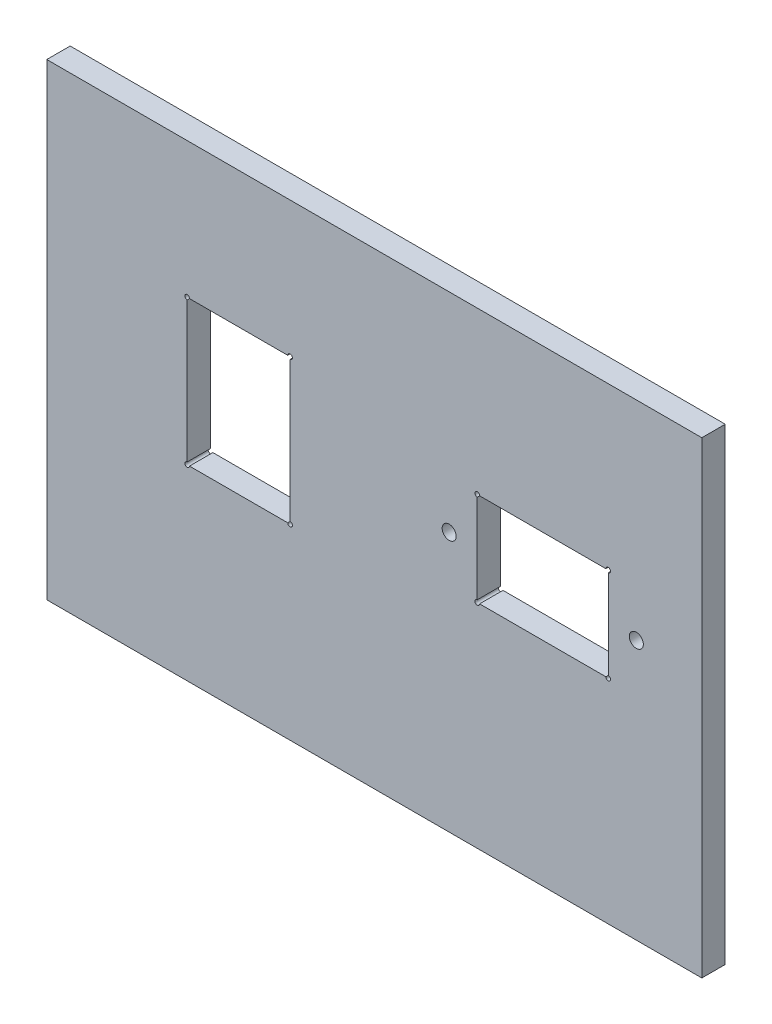
ISO-10303-21;
HEADER;
FILE_DESCRIPTION(('STEP AP214'),'2;1');
FILE_NAME('part.step','',(''),(''),'','','');
FILE_SCHEMA(('AUTOMOTIVE_DESIGN { 1 0 10303 214 1 1 1 1 }'));
ENDSEC;
DATA;
#1=APPLICATION_CONTEXT('core data for automotive mechanical design processes');
#2=APPLICATION_PROTOCOL_DEFINITION('international standard','automotive_design',2000,#1);
#3=PRODUCT_CONTEXT('',#1,'mechanical');
#4=PRODUCT('Part','Part','',(#3));
#5=PRODUCT_RELATED_PRODUCT_CATEGORY('part','',(#4));
#6=PRODUCT_DEFINITION_FORMATION('','',#4);
#7=PRODUCT_DEFINITION_CONTEXT('part definition',#1,'design');
#8=PRODUCT_DEFINITION('design','',#6,#7);
#9=PRODUCT_DEFINITION_SHAPE('','',#8);
#10=(LENGTH_UNIT() NAMED_UNIT(*) SI_UNIT(.MILLI.,.METRE.));
#11=(NAMED_UNIT(*) PLANE_ANGLE_UNIT() SI_UNIT($,.RADIAN.));
#12=(NAMED_UNIT(*) SI_UNIT($,.STERADIAN.) SOLID_ANGLE_UNIT());
#13=UNCERTAINTY_MEASURE_WITH_UNIT(LENGTH_MEASURE(1.E-05),#10,'distance_accuracy_value','');
#14=(GEOMETRIC_REPRESENTATION_CONTEXT(3) GLOBAL_UNCERTAINTY_ASSIGNED_CONTEXT((#13)) GLOBAL_UNIT_ASSIGNED_CONTEXT((#10,
#11,#12)) REPRESENTATION_CONTEXT('',''));
#15=CARTESIAN_POINT('',(0.,0.,0.));
#16=DIRECTION('',(0.,0.,1.));
#17=DIRECTION('',(1.,0.,0.));
#18=AXIS2_PLACEMENT_3D('',#15,#16,#17);
#19=CARTESIAN_POINT('',(70.,50.,5.));
#20=DIRECTION('',(-1.,0.,0.));
#21=DIRECTION('',(0.,0.,1.));
#22=AXIS2_PLACEMENT_3D('',#19,#20,#21);
#23=PLANE('',#22);
#24=DIRECTION('',(0.,1.,0.));
#25=VECTOR('',#24,1.);
#26=CARTESIAN_POINT('',(70.,50.,0.));
#27=LINE('',#26,#25);
#28=CARTESIAN_POINT('',(70.,-50.,0.));
#29=VERTEX_POINT('',#28);
#30=CARTESIAN_POINT('',(70.,50.,0.));
#31=VERTEX_POINT('',#30);
#32=EDGE_CURVE('E226',#29,#31,#27,.T.);
#33=ORIENTED_EDGE('',*,*,#32,.T.);
#34=DIRECTION('',(0.,0.,-1.));
#35=VECTOR('',#34,1.);
#36=CARTESIAN_POINT('',(70.,50.,5.));
#37=LINE('',#36,#35);
#38=CARTESIAN_POINT('',(70.,50.,5.));
#39=VERTEX_POINT('',#38);
#40=EDGE_CURVE('E263',#39,#31,#37,.T.);
#41=ORIENTED_EDGE('',*,*,#40,.F.);
#42=DIRECTION('',(0.,1.,0.));
#43=VECTOR('',#42,1.);
#44=CARTESIAN_POINT('',(70.,50.,5.));
#45=LINE('',#44,#43);
#46=CARTESIAN_POINT('',(70.,-50.,5.));
#47=VERTEX_POINT('',#46);
#48=EDGE_CURVE('E237',#47,#39,#45,.T.);
#49=ORIENTED_EDGE('',*,*,#48,.F.);
#50=DIRECTION('',(0.,0.,-1.));
#51=VECTOR('',#50,1.);
#52=CARTESIAN_POINT('',(70.,-50.,5.));
#53=LINE('',#52,#51);
#54=EDGE_CURVE('E247',#47,#29,#53,.T.);
#55=ORIENTED_EDGE('',*,*,#54,.T.);
#56=EDGE_LOOP('',(#33,#41,#49,#55));
#57=FACE_BOUND('',#56,.T.);
#58=ADVANCED_FACE('F34',(#57),#23,.F.);
#59=CARTESIAN_POINT('',(-70.,50.,5.));
#60=DIRECTION('',(0.,-1.,0.));
#61=DIRECTION('',(0.,0.,-1.));
#62=AXIS2_PLACEMENT_3D('',#59,#60,#61);
#63=PLANE('',#62);
#64=DIRECTION('',(-1.,0.,0.));
#65=VECTOR('',#64,1.);
#66=CARTESIAN_POINT('',(-70.,50.,0.));
#67=LINE('',#66,#65);
#68=CARTESIAN_POINT('',(-70.,50.,0.));
#69=VERTEX_POINT('',#68);
#70=EDGE_CURVE('E250',#31,#69,#67,.T.);
#71=ORIENTED_EDGE('',*,*,#70,.T.);
#72=DIRECTION('',(0.,0.,-1.));
#73=VECTOR('',#72,1.);
#74=CARTESIAN_POINT('',(-70.,50.,5.));
#75=LINE('',#74,#73);
#76=CARTESIAN_POINT('',(-70.,50.,5.));
#77=VERTEX_POINT('',#76);
#78=EDGE_CURVE('E260',#77,#69,#75,.T.);
#79=ORIENTED_EDGE('',*,*,#78,.F.);
#80=DIRECTION('',(-1.,0.,0.));
#81=VECTOR('',#80,1.);
#82=CARTESIAN_POINT('',(-70.,50.,5.));
#83=LINE('',#82,#81);
#84=EDGE_CURVE('E240',#39,#77,#83,.T.);
#85=ORIENTED_EDGE('',*,*,#84,.F.);
#86=ORIENTED_EDGE('',*,*,#40,.T.);
#87=EDGE_LOOP('',(#71,#79,#85,#86));
#88=FACE_BOUND('',#87,.T.);
#89=ADVANCED_FACE('F400',(#88),#63,.F.);
#90=CARTESIAN_POINT('',(-70.,50.,5.));
#91=DIRECTION('',(1.,0.,0.));
#92=DIRECTION('',(0.,1.,0.));
#93=AXIS2_PLACEMENT_3D('',#90,#91,#92);
#94=PLANE('',#93);
#95=DIRECTION('',(0.,-1.,0.));
#96=VECTOR('',#95,1.);
#97=CARTESIAN_POINT('',(-70.,50.,0.));
#98=LINE('',#97,#96);
#99=CARTESIAN_POINT('',(-70.,-50.,0.));
#100=VERTEX_POINT('',#99);
#101=EDGE_CURVE('E252',#69,#100,#98,.T.);
#102=ORIENTED_EDGE('',*,*,#101,.T.);
#103=DIRECTION('',(0.,0.,-1.));
#104=VECTOR('',#103,1.);
#105=CARTESIAN_POINT('',(-70.,-50.,5.));
#106=LINE('',#105,#104);
#107=CARTESIAN_POINT('',(-70.,-50.,5.));
#108=VERTEX_POINT('',#107);
#109=EDGE_CURVE('E257',#108,#100,#106,.T.);
#110=ORIENTED_EDGE('',*,*,#109,.F.);
#111=DIRECTION('',(0.,-1.,0.));
#112=VECTOR('',#111,1.);
#113=CARTESIAN_POINT('',(-70.,50.,5.));
#114=LINE('',#113,#112);
#115=EDGE_CURVE('E243',#77,#108,#114,.T.);
#116=ORIENTED_EDGE('',*,*,#115,.F.);
#117=ORIENTED_EDGE('',*,*,#78,.T.);
#118=EDGE_LOOP('',(#102,#110,#116,#117));
#119=FACE_BOUND('',#118,.T.);
#120=ADVANCED_FACE('F405',(#119),#94,.F.);
#121=CARTESIAN_POINT('',(-70.,-50.,5.));
#122=DIRECTION('',(0.,1.,0.));
#123=DIRECTION('',(0.,0.,1.));
#124=AXIS2_PLACEMENT_3D('',#121,#122,#123);
#125=PLANE('',#124);
#126=DIRECTION('',(1.,0.,0.));
#127=VECTOR('',#126,1.);
#128=CARTESIAN_POINT('',(-70.,-50.,0.));
#129=LINE('',#128,#127);
#130=EDGE_CURVE('E241',#100,#29,#129,.T.);
#131=ORIENTED_EDGE('',*,*,#130,.T.);
#132=ORIENTED_EDGE('',*,*,#54,.F.);
#133=DIRECTION('',(1.,0.,0.));
#134=VECTOR('',#133,1.);
#135=CARTESIAN_POINT('',(-70.,-50.,5.));
#136=LINE('',#135,#134);
#137=EDGE_CURVE('E245',#108,#47,#136,.T.);
#138=ORIENTED_EDGE('',*,*,#137,.F.);
#139=ORIENTED_EDGE('',*,*,#109,.T.);
#140=EDGE_LOOP('',(#131,#132,#138,#139));
#141=FACE_BOUND('',#140,.T.);
#142=ADVANCED_FACE('F419',(#141),#125,.F.);
#143=CARTESIAN_POINT('',(0.,0.,5.));
#144=DIRECTION('',(0.,0.,1.));
#145=DIRECTION('',(1.,0.,0.));
#146=AXIS2_PLACEMENT_3D('',#143,#144,#145);
#147=PLANE('',#146);
#148=CARTESIAN_POINT('',(-18.,21.,5.));
#149=DIRECTION('',(0.,0.,1.));
#150=DIRECTION('',(1.,0.,0.));
#151=AXIS2_PLACEMENT_3D('',#148,#149,#150);
#152=CIRCLE('',#151,0.499999999999999);
#153=CARTESIAN_POINT('',(-18.,20.5,5.));
#154=VERTEX_POINT('',#153);
#155=CARTESIAN_POINT('',(-18.5,21.,5.));
#156=VERTEX_POINT('',#155);
#157=EDGE_CURVE('E364',#154,#156,#152,.T.);
#158=ORIENTED_EDGE('',*,*,#157,.F.);
#159=DIRECTION('',(0.,1.,0.));
#160=VECTOR('',#159,1.);
#161=CARTESIAN_POINT('',(-18.,21.,5.));
#162=LINE('',#161,#160);
#163=CARTESIAN_POINT('',(-18.,-9.50000000000001,5.));
#164=VERTEX_POINT('',#163);
#165=EDGE_CURVE('E227',#164,#154,#162,.T.);
#166=ORIENTED_EDGE('',*,*,#165,.F.);
#167=CARTESIAN_POINT('',(-18.,-10.,5.));
#168=DIRECTION('',(0.,0.,1.));
#169=DIRECTION('',(1.,0.,0.));
#170=AXIS2_PLACEMENT_3D('',#167,#168,#169);
#171=CIRCLE('',#170,0.499999999999999);
#172=CARTESIAN_POINT('',(-18.5,-10.,5.));
#173=VERTEX_POINT('',#172);
#174=EDGE_CURVE('E362',#173,#164,#171,.T.);
#175=ORIENTED_EDGE('',*,*,#174,.F.);
#176=DIRECTION('',(1.,0.,0.));
#177=VECTOR('',#176,1.);
#178=CARTESIAN_POINT('',(-40.,-10.,5.));
#179=LINE('',#178,#177);
#180=CARTESIAN_POINT('',(-39.5,-10.,5.));
#181=VERTEX_POINT('',#180);
#182=EDGE_CURVE('E218',#181,#173,#179,.T.);
#183=ORIENTED_EDGE('',*,*,#182,.F.);
#184=CARTESIAN_POINT('',(-40.,-10.,5.));
#185=DIRECTION('',(0.,0.,1.));
#186=DIRECTION('',(1.,0.,0.));
#187=AXIS2_PLACEMENT_3D('',#184,#185,#186);
#188=CIRCLE('',#187,0.499999999999999);
#189=CARTESIAN_POINT('',(-40.,-9.50000000000002,5.));
#190=VERTEX_POINT('',#189);
#191=EDGE_CURVE('E373',#190,#181,#188,.T.);
#192=ORIENTED_EDGE('',*,*,#191,.F.);
#193=DIRECTION('',(0.,-1.,0.));
#194=VECTOR('',#193,1.);
#195=CARTESIAN_POINT('',(-40.,21.,5.));
#196=LINE('',#195,#194);
#197=CARTESIAN_POINT('',(-40.,20.5,5.));
#198=VERTEX_POINT('',#197);
#199=EDGE_CURVE('E232',#198,#190,#196,.T.);
#200=ORIENTED_EDGE('',*,*,#199,.F.);
#201=CARTESIAN_POINT('',(-40.,21.,5.));
#202=DIRECTION('',(0.,0.,1.));
#203=DIRECTION('',(1.,0.,0.));
#204=AXIS2_PLACEMENT_3D('',#201,#202,#203);
#205=CIRCLE('',#204,0.499999999999999);
#206=CARTESIAN_POINT('',(-39.5,21.,5.));
#207=VERTEX_POINT('',#206);
#208=EDGE_CURVE('E300',#207,#198,#205,.T.);
#209=ORIENTED_EDGE('',*,*,#208,.F.);
#210=DIRECTION('',(-1.,0.,0.));
#211=VECTOR('',#210,1.);
#212=CARTESIAN_POINT('',(-40.,21.,5.));
#213=LINE('',#212,#211);
#214=EDGE_CURVE('E230',#156,#207,#213,.T.);
#215=ORIENTED_EDGE('',*,*,#214,.F.);
#216=EDGE_LOOP('',(#158,#166,#175,#183,#192,#200,#209,#215));
#217=FACE_BOUND('',#216,.T.);
#218=CARTESIAN_POINT('',(22.,15.5,5.));
#219=DIRECTION('',(0.,0.,1.));
#220=DIRECTION('',(1.,0.,0.));
#221=AXIS2_PLACEMENT_3D('',#218,#219,#220);
#222=CIRCLE('',#221,0.499999999999999);
#223=CARTESIAN_POINT('',(22.5,15.5,5.));
#224=VERTEX_POINT('',#223);
#225=CARTESIAN_POINT('',(22.,15.,5.));
#226=VERTEX_POINT('',#225);
#227=EDGE_CURVE('E377',#224,#226,#222,.T.);
#228=ORIENTED_EDGE('',*,*,#227,.F.);
#229=DIRECTION('',(-1.,0.,0.));
#230=VECTOR('',#229,1.);
#231=CARTESIAN_POINT('',(22.,15.5,5.));
#232=LINE('',#231,#230);
#233=CARTESIAN_POINT('',(49.5,15.5,5.));
#234=VERTEX_POINT('',#233);
#235=EDGE_CURVE('E191',#234,#224,#232,.T.);
#236=ORIENTED_EDGE('',*,*,#235,.F.);
#237=CARTESIAN_POINT('',(50.,15.5,5.));
#238=DIRECTION('',(0.,0.,1.));
#239=DIRECTION('',(1.,0.,0.));
#240=AXIS2_PLACEMENT_3D('',#237,#238,#239);
#241=CIRCLE('',#240,0.499999999999999);
#242=CARTESIAN_POINT('',(50.,15.,5.));
#243=VERTEX_POINT('',#242);
#244=EDGE_CURVE('E171',#243,#234,#241,.T.);
#245=ORIENTED_EDGE('',*,*,#244,.F.);
#246=DIRECTION('',(0.,1.,0.));
#247=VECTOR('',#246,1.);
#248=CARTESIAN_POINT('',(50.,15.5,5.));
#249=LINE('',#248,#247);
#250=CARTESIAN_POINT('',(50.,-4.,5.));
#251=VERTEX_POINT('',#250);
#252=EDGE_CURVE('E189',#251,#243,#249,.T.);
#253=ORIENTED_EDGE('',*,*,#252,.F.);
#254=CARTESIAN_POINT('',(50.,-4.5,5.));
#255=DIRECTION('',(0.,0.,1.));
#256=DIRECTION('',(1.,0.,0.));
#257=AXIS2_PLACEMENT_3D('',#254,#255,#256);
#258=CIRCLE('',#257,0.499999999999999);
#259=CARTESIAN_POINT('',(49.5,-4.5,5.));
#260=VERTEX_POINT('',#259);
#261=EDGE_CURVE('E336',#260,#251,#258,.T.);
#262=ORIENTED_EDGE('',*,*,#261,.F.);
#263=DIRECTION('',(1.,0.,0.));
#264=VECTOR('',#263,1.);
#265=CARTESIAN_POINT('',(22.,-4.5,5.));
#266=LINE('',#265,#264);
#267=CARTESIAN_POINT('',(22.5,-4.5,5.));
#268=VERTEX_POINT('',#267);
#269=EDGE_CURVE('E210',#268,#260,#266,.T.);
#270=ORIENTED_EDGE('',*,*,#269,.F.);
#271=CARTESIAN_POINT('',(22.,-4.5,5.));
#272=DIRECTION('',(0.,0.,1.));
#273=DIRECTION('',(1.,0.,0.));
#274=AXIS2_PLACEMENT_3D('',#271,#272,#273);
#275=CIRCLE('',#274,0.499999999999999);
#276=CARTESIAN_POINT('',(22.,-4.,5.));
#277=VERTEX_POINT('',#276);
#278=EDGE_CURVE('E340',#277,#268,#275,.T.);
#279=ORIENTED_EDGE('',*,*,#278,.F.);
#280=DIRECTION('',(0.,-1.,0.));
#281=VECTOR('',#280,1.);
#282=CARTESIAN_POINT('',(22.,15.5,5.));
#283=LINE('',#282,#281);
#284=EDGE_CURVE('E199',#226,#277,#283,.T.);
#285=ORIENTED_EDGE('',*,*,#284,.F.);
#286=EDGE_LOOP('',(#228,#236,#245,#253,#262,#270,#279,#285));
#287=FACE_BOUND('',#286,.T.);
#288=CARTESIAN_POINT('',(16.,5.49999999999999,5.));
#289=DIRECTION('',(0.,0.,1.));
#290=DIRECTION('',(1.,0.,0.));
#291=AXIS2_PLACEMENT_3D('',#288,#289,#290);
#292=CIRCLE('',#291,1.5);
#293=CARTESIAN_POINT('',(17.5,5.49999999999999,5.));
#294=VERTEX_POINT('',#293);
#295=EDGE_CURVE('E202',#294,#294,#292,.T.);
#296=ORIENTED_EDGE('',*,*,#295,.F.);
#297=EDGE_LOOP('',(#296));
#298=FACE_BOUND('',#297,.T.);
#299=CARTESIAN_POINT('',(56.,5.50000000000001,5.));
#300=DIRECTION('',(0.,0.,1.));
#301=DIRECTION('',(1.,0.,0.));
#302=AXIS2_PLACEMENT_3D('',#299,#300,#301);
#303=CIRCLE('',#302,1.5);
#304=CARTESIAN_POINT('',(57.5,5.50000000000001,5.));
#305=VERTEX_POINT('',#304);
#306=EDGE_CURVE('E302',#305,#305,#303,.T.);
#307=ORIENTED_EDGE('',*,*,#306,.F.);
#308=EDGE_LOOP('',(#307));
#309=FACE_BOUND('',#308,.T.);
#310=ORIENTED_EDGE('',*,*,#48,.T.);
#311=ORIENTED_EDGE('',*,*,#84,.T.);
#312=ORIENTED_EDGE('',*,*,#115,.T.);
#313=ORIENTED_EDGE('',*,*,#137,.T.);
#314=EDGE_LOOP('',(#310,#311,#312,#313));
#315=FACE_BOUND('',#314,.T.);
#316=ADVANCED_FACE('F186',(#217,#287,#298,#309,#315),#147,.T.);
#317=CARTESIAN_POINT('',(0.,0.,0.));
#318=DIRECTION('',(0.,0.,1.));
#319=DIRECTION('',(1.,0.,0.));
#320=AXIS2_PLACEMENT_3D('',#317,#318,#319);
#321=PLANE('',#320);
#322=CARTESIAN_POINT('',(16.,5.49999999999999,0.));
#323=DIRECTION('',(0.,0.,1.));
#324=DIRECTION('',(1.,0.,0.));
#325=AXIS2_PLACEMENT_3D('',#322,#323,#324);
#326=CIRCLE('',#325,1.5);
#327=CARTESIAN_POINT('',(17.5,5.49999999999999,0.));
#328=VERTEX_POINT('',#327);
#329=EDGE_CURVE('E197',#328,#328,#326,.T.);
#330=ORIENTED_EDGE('',*,*,#329,.T.);
#331=EDGE_LOOP('',(#330));
#332=FACE_BOUND('',#331,.T.);
#333=CARTESIAN_POINT('',(56.,5.50000000000001,0.));
#334=DIRECTION('',(0.,0.,1.));
#335=DIRECTION('',(1.,0.,0.));
#336=AXIS2_PLACEMENT_3D('',#333,#334,#335);
#337=CIRCLE('',#336,1.5);
#338=CARTESIAN_POINT('',(57.5,5.50000000000001,0.));
#339=VERTEX_POINT('',#338);
#340=EDGE_CURVE('E311',#339,#339,#337,.T.);
#341=ORIENTED_EDGE('',*,*,#340,.T.);
#342=EDGE_LOOP('',(#341));
#343=FACE_BOUND('',#342,.T.);
#344=DIRECTION('',(-1.,0.,0.));
#345=VECTOR('',#344,1.);
#346=CARTESIAN_POINT('',(22.,15.5,0.));
#347=LINE('',#346,#345);
#348=CARTESIAN_POINT('',(49.5,15.5,0.));
#349=VERTEX_POINT('',#348);
#350=CARTESIAN_POINT('',(22.5,15.5,0.));
#351=VERTEX_POINT('',#350);
#352=EDGE_CURVE('E317',#349,#351,#347,.T.);
#353=ORIENTED_EDGE('',*,*,#352,.T.);
#354=CARTESIAN_POINT('',(22.,15.5,0.));
#355=DIRECTION('',(0.,0.,1.));
#356=DIRECTION('',(1.,0.,0.));
#357=AXIS2_PLACEMENT_3D('',#354,#355,#356);
#358=CIRCLE('',#357,0.499999999999999);
#359=CARTESIAN_POINT('',(22.,15.,0.));
#360=VERTEX_POINT('',#359);
#361=EDGE_CURVE('E375',#351,#360,#358,.T.);
#362=ORIENTED_EDGE('',*,*,#361,.T.);
#363=DIRECTION('',(0.,-1.,0.));
#364=VECTOR('',#363,1.);
#365=CARTESIAN_POINT('',(22.,15.5,0.));
#366=LINE('',#365,#364);
#367=CARTESIAN_POINT('',(22.,-4.,0.));
#368=VERTEX_POINT('',#367);
#369=EDGE_CURVE('E319',#360,#368,#366,.T.);
#370=ORIENTED_EDGE('',*,*,#369,.T.);
#371=CARTESIAN_POINT('',(22.,-4.5,0.));
#372=DIRECTION('',(0.,0.,1.));
#373=DIRECTION('',(1.,0.,0.));
#374=AXIS2_PLACEMENT_3D('',#371,#372,#373);
#375=CIRCLE('',#374,0.499999999999999);
#376=CARTESIAN_POINT('',(22.5,-4.5,0.));
#377=VERTEX_POINT('',#376);
#378=EDGE_CURVE('E328',#368,#377,#375,.T.);
#379=ORIENTED_EDGE('',*,*,#378,.T.);
#380=DIRECTION('',(1.,0.,0.));
#381=VECTOR('',#380,1.);
#382=CARTESIAN_POINT('',(22.,-4.5,0.));
#383=LINE('',#382,#381);
#384=CARTESIAN_POINT('',(49.5,-4.5,0.));
#385=VERTEX_POINT('',#384);
#386=EDGE_CURVE('E205',#377,#385,#383,.T.);
#387=ORIENTED_EDGE('',*,*,#386,.T.);
#388=CARTESIAN_POINT('',(50.,-4.5,0.));
#389=DIRECTION('',(0.,0.,1.));
#390=DIRECTION('',(1.,0.,0.));
#391=AXIS2_PLACEMENT_3D('',#388,#389,#390);
#392=CIRCLE('',#391,0.499999999999999);
#393=CARTESIAN_POINT('',(50.,-4.,0.));
#394=VERTEX_POINT('',#393);
#395=EDGE_CURVE('E192',#385,#394,#392,.T.);
#396=ORIENTED_EDGE('',*,*,#395,.T.);
#397=DIRECTION('',(0.,1.,0.));
#398=VECTOR('',#397,1.);
#399=CARTESIAN_POINT('',(50.,15.5,0.));
#400=LINE('',#399,#398);
#401=CARTESIAN_POINT('',(50.,15.,0.));
#402=VERTEX_POINT('',#401);
#403=EDGE_CURVE('E213',#394,#402,#400,.T.);
#404=ORIENTED_EDGE('',*,*,#403,.T.);
#405=CARTESIAN_POINT('',(50.,15.5,0.));
#406=DIRECTION('',(0.,0.,1.));
#407=DIRECTION('',(1.,0.,0.));
#408=AXIS2_PLACEMENT_3D('',#405,#406,#407);
#409=CIRCLE('',#408,0.499999999999999);
#410=EDGE_CURVE('E174',#402,#349,#409,.T.);
#411=ORIENTED_EDGE('',*,*,#410,.T.);
#412=EDGE_LOOP('',(#353,#362,#370,#379,#387,#396,#404,#411));
#413=FACE_BOUND('',#412,.T.);
#414=DIRECTION('',(0.,1.,0.));
#415=VECTOR('',#414,1.);
#416=CARTESIAN_POINT('',(-18.,21.,0.));
#417=LINE('',#416,#415);
#418=CARTESIAN_POINT('',(-18.,-9.50000000000001,0.));
#419=VERTEX_POINT('',#418);
#420=CARTESIAN_POINT('',(-18.,20.5,0.));
#421=VERTEX_POINT('',#420);
#422=EDGE_CURVE('E214',#419,#421,#417,.T.);
#423=ORIENTED_EDGE('',*,*,#422,.T.);
#424=CARTESIAN_POINT('',(-18.,21.,0.));
#425=DIRECTION('',(0.,0.,1.));
#426=DIRECTION('',(1.,0.,0.));
#427=AXIS2_PLACEMENT_3D('',#424,#425,#426);
#428=CIRCLE('',#427,0.499999999999999);
#429=CARTESIAN_POINT('',(-18.5,21.,0.));
#430=VERTEX_POINT('',#429);
#431=EDGE_CURVE('E180',#421,#430,#428,.T.);
#432=ORIENTED_EDGE('',*,*,#431,.T.);
#433=DIRECTION('',(-1.,0.,0.));
#434=VECTOR('',#433,1.);
#435=CARTESIAN_POINT('',(-40.,21.,0.));
#436=LINE('',#435,#434);
#437=CARTESIAN_POINT('',(-39.5,21.,0.));
#438=VERTEX_POINT('',#437);
#439=EDGE_CURVE('E217',#430,#438,#436,.T.);
#440=ORIENTED_EDGE('',*,*,#439,.T.);
#441=CARTESIAN_POINT('',(-40.,21.,0.));
#442=DIRECTION('',(0.,0.,1.));
#443=DIRECTION('',(1.,0.,0.));
#444=AXIS2_PLACEMENT_3D('',#441,#442,#443);
#445=CIRCLE('',#444,0.499999999999999);
#446=CARTESIAN_POINT('',(-40.,20.5,0.));
#447=VERTEX_POINT('',#446);
#448=EDGE_CURVE('E294',#438,#447,#445,.T.);
#449=ORIENTED_EDGE('',*,*,#448,.T.);
#450=DIRECTION('',(0.,-1.,0.));
#451=VECTOR('',#450,1.);
#452=CARTESIAN_POINT('',(-40.,21.,0.));
#453=LINE('',#452,#451);
#454=CARTESIAN_POINT('',(-40.,-9.50000000000002,0.));
#455=VERTEX_POINT('',#454);
#456=EDGE_CURVE('E220',#447,#455,#453,.T.);
#457=ORIENTED_EDGE('',*,*,#456,.T.);
#458=CARTESIAN_POINT('',(-40.,-10.,0.));
#459=DIRECTION('',(0.,0.,1.));
#460=DIRECTION('',(1.,0.,0.));
#461=AXIS2_PLACEMENT_3D('',#458,#459,#460);
#462=CIRCLE('',#461,0.499999999999999);
#463=CARTESIAN_POINT('',(-39.5,-10.,0.));
#464=VERTEX_POINT('',#463);
#465=EDGE_CURVE('E55',#455,#464,#462,.T.);
#466=ORIENTED_EDGE('',*,*,#465,.T.);
#467=DIRECTION('',(1.,0.,0.));
#468=VECTOR('',#467,1.);
#469=CARTESIAN_POINT('',(-40.,-10.,0.));
#470=LINE('',#469,#468);
#471=CARTESIAN_POINT('',(-18.5,-10.,0.));
#472=VERTEX_POINT('',#471);
#473=EDGE_CURVE('E223',#464,#472,#470,.T.);
#474=ORIENTED_EDGE('',*,*,#473,.T.);
#475=CARTESIAN_POINT('',(-18.,-10.,0.));
#476=DIRECTION('',(0.,0.,1.));
#477=DIRECTION('',(1.,0.,0.));
#478=AXIS2_PLACEMENT_3D('',#475,#476,#477);
#479=CIRCLE('',#478,0.499999999999999);
#480=EDGE_CURVE('E48',#472,#419,#479,.T.);
#481=ORIENTED_EDGE('',*,*,#480,.T.);
#482=EDGE_LOOP('',(#423,#432,#440,#449,#457,#466,#474,#481));
#483=FACE_BOUND('',#482,.T.);
#484=ORIENTED_EDGE('',*,*,#32,.F.);
#485=ORIENTED_EDGE('',*,*,#130,.F.);
#486=ORIENTED_EDGE('',*,*,#101,.F.);
#487=ORIENTED_EDGE('',*,*,#70,.F.);
#488=EDGE_LOOP('',(#484,#485,#486,#487));
#489=FACE_BOUND('',#488,.T.);
#490=ADVANCED_FACE('F290',(#332,#343,#413,#483,#489),#321,.F.);
#491=CARTESIAN_POINT('',(-18.,21.,0.));
#492=DIRECTION('',(1.,0.,0.));
#493=DIRECTION('',(0.,1.,0.));
#494=AXIS2_PLACEMENT_3D('',#491,#492,#493);
#495=PLANE('',#494);
#496=ORIENTED_EDGE('',*,*,#165,.T.);
#497=DIRECTION('',(0.,0.,1.));
#498=VECTOR('',#497,1.);
#499=CARTESIAN_POINT('',(-18.,20.5,0.));
#500=LINE('',#499,#498);
#501=EDGE_CURVE('E348',#154,#421,#500,.F.);
#502=ORIENTED_EDGE('',*,*,#501,.T.);
#503=ORIENTED_EDGE('',*,*,#422,.F.);
#504=DIRECTION('',(0.,0.,1.));
#505=VECTOR('',#504,1.);
#506=CARTESIAN_POINT('',(-18.,-9.50000000000001,0.));
#507=LINE('',#506,#505);
#508=EDGE_CURVE('E304',#419,#164,#507,.T.);
#509=ORIENTED_EDGE('',*,*,#508,.T.);
#510=EDGE_LOOP('',(#496,#502,#503,#509));
#511=FACE_BOUND('',#510,.T.);
#512=ADVANCED_FACE('F358',(#511),#495,.F.);
#513=CARTESIAN_POINT('',(-40.,-10.,0.));
#514=DIRECTION('',(0.,-1.,0.));
#515=DIRECTION('',(1.,0.,0.));
#516=AXIS2_PLACEMENT_3D('',#513,#514,#515);
#517=PLANE('',#516);
#518=ORIENTED_EDGE('',*,*,#182,.T.);
#519=DIRECTION('',(0.,0.,1.));
#520=VECTOR('',#519,1.);
#521=CARTESIAN_POINT('',(-18.5,-10.,0.));
#522=LINE('',#521,#520);
#523=EDGE_CURVE('E11',#173,#472,#522,.F.);
#524=ORIENTED_EDGE('',*,*,#523,.T.);
#525=ORIENTED_EDGE('',*,*,#473,.F.);
#526=DIRECTION('',(0.,0.,1.));
#527=VECTOR('',#526,1.);
#528=CARTESIAN_POINT('',(-39.5,-10.,0.));
#529=LINE('',#528,#527);
#530=EDGE_CURVE('E350',#464,#181,#529,.T.);
#531=ORIENTED_EDGE('',*,*,#530,.T.);
#532=EDGE_LOOP('',(#518,#524,#525,#531));
#533=FACE_BOUND('',#532,.T.);
#534=ADVANCED_FACE('F435',(#533),#517,.F.);
#535=CARTESIAN_POINT('',(-40.,21.,0.));
#536=DIRECTION('',(-1.,0.,0.));
#537=DIRECTION('',(0.,0.,1.));
#538=AXIS2_PLACEMENT_3D('',#535,#536,#537);
#539=PLANE('',#538);
#540=ORIENTED_EDGE('',*,*,#199,.T.);
#541=DIRECTION('',(0.,0.,1.));
#542=VECTOR('',#541,1.);
#543=CARTESIAN_POINT('',(-40.,-9.50000000000002,0.));
#544=LINE('',#543,#542);
#545=EDGE_CURVE('E41',#190,#455,#544,.F.);
#546=ORIENTED_EDGE('',*,*,#545,.T.);
#547=ORIENTED_EDGE('',*,*,#456,.F.);
#548=DIRECTION('',(0.,0.,1.));
#549=VECTOR('',#548,1.);
#550=CARTESIAN_POINT('',(-40.,20.5,0.));
#551=LINE('',#550,#549);
#552=EDGE_CURVE('E299',#447,#198,#551,.T.);
#553=ORIENTED_EDGE('',*,*,#552,.T.);
#554=EDGE_LOOP('',(#540,#546,#547,#553));
#555=FACE_BOUND('',#554,.T.);
#556=ADVANCED_FACE('F284',(#555),#539,.F.);
#557=CARTESIAN_POINT('',(-40.,21.,0.));
#558=DIRECTION('',(0.,1.,0.));
#559=DIRECTION('',(0.,0.,1.));
#560=AXIS2_PLACEMENT_3D('',#557,#558,#559);
#561=PLANE('',#560);
#562=ORIENTED_EDGE('',*,*,#439,.F.);
#563=DIRECTION('',(0.,0.,1.));
#564=VECTOR('',#563,1.);
#565=CARTESIAN_POINT('',(-18.5,21.,0.));
#566=LINE('',#565,#564);
#567=EDGE_CURVE('E280',#430,#156,#566,.T.);
#568=ORIENTED_EDGE('',*,*,#567,.T.);
#569=ORIENTED_EDGE('',*,*,#214,.T.);
#570=DIRECTION('',(0.,0.,1.));
#571=VECTOR('',#570,1.);
#572=CARTESIAN_POINT('',(-39.5,21.,0.));
#573=LINE('',#572,#571);
#574=EDGE_CURVE('E266',#207,#438,#573,.F.);
#575=ORIENTED_EDGE('',*,*,#574,.T.);
#576=EDGE_LOOP('',(#562,#568,#569,#575));
#577=FACE_BOUND('',#576,.T.);
#578=ADVANCED_FACE('F436',(#577),#561,.F.);
#579=CARTESIAN_POINT('',(50.,15.5,0.));
#580=DIRECTION('',(1.,0.,0.));
#581=DIRECTION('',(0.,0.,-1.));
#582=AXIS2_PLACEMENT_3D('',#579,#580,#581);
#583=PLANE('',#582);
#584=ORIENTED_EDGE('',*,*,#252,.T.);
#585=DIRECTION('',(0.,0.,1.));
#586=VECTOR('',#585,1.);
#587=CARTESIAN_POINT('',(50.,15.,0.));
#588=LINE('',#587,#586);
#589=EDGE_CURVE('E168',#243,#402,#588,.F.);
#590=ORIENTED_EDGE('',*,*,#589,.T.);
#591=ORIENTED_EDGE('',*,*,#403,.F.);
#592=DIRECTION('',(0.,0.,1.));
#593=VECTOR('',#592,1.);
#594=CARTESIAN_POINT('',(50.,-4.,0.));
#595=LINE('',#594,#593);
#596=EDGE_CURVE('E196',#394,#251,#595,.T.);
#597=ORIENTED_EDGE('',*,*,#596,.T.);
#598=EDGE_LOOP('',(#584,#590,#591,#597));
#599=FACE_BOUND('',#598,.T.);
#600=ADVANCED_FACE('F195',(#599),#583,.F.);
#601=CARTESIAN_POINT('',(22.,-4.5,0.));
#602=DIRECTION('',(0.,-1.,0.));
#603=DIRECTION('',(0.,0.,-1.));
#604=AXIS2_PLACEMENT_3D('',#601,#602,#603);
#605=PLANE('',#604);
#606=ORIENTED_EDGE('',*,*,#269,.T.);
#607=DIRECTION('',(0.,0.,1.));
#608=VECTOR('',#607,1.);
#609=CARTESIAN_POINT('',(49.5,-4.5,0.));
#610=LINE('',#609,#608);
#611=EDGE_CURVE('E277',#260,#385,#610,.F.);
#612=ORIENTED_EDGE('',*,*,#611,.T.);
#613=ORIENTED_EDGE('',*,*,#386,.F.);
#614=DIRECTION('',(0.,0.,1.));
#615=VECTOR('',#614,1.);
#616=CARTESIAN_POINT('',(22.5,-4.5,0.));
#617=LINE('',#616,#615);
#618=EDGE_CURVE('E332',#377,#268,#617,.T.);
#619=ORIENTED_EDGE('',*,*,#618,.T.);
#620=EDGE_LOOP('',(#606,#612,#613,#619));
#621=FACE_BOUND('',#620,.T.);
#622=ADVANCED_FACE('F331',(#621),#605,.F.);
#623=CARTESIAN_POINT('',(22.,15.5,0.));
#624=DIRECTION('',(-1.,0.,0.));
#625=DIRECTION('',(0.,-1.,0.));
#626=AXIS2_PLACEMENT_3D('',#623,#624,#625);
#627=PLANE('',#626);
#628=ORIENTED_EDGE('',*,*,#369,.F.);
#629=DIRECTION('',(0.,0.,1.));
#630=VECTOR('',#629,1.);
#631=CARTESIAN_POINT('',(22.,15.,0.));
#632=LINE('',#631,#630);
#633=EDGE_CURVE('E179',#360,#226,#632,.T.);
#634=ORIENTED_EDGE('',*,*,#633,.T.);
#635=ORIENTED_EDGE('',*,*,#284,.T.);
#636=DIRECTION('',(0.,0.,1.));
#637=VECTOR('',#636,1.);
#638=CARTESIAN_POINT('',(22.,-4.,0.));
#639=LINE('',#638,#637);
#640=EDGE_CURVE('E274',#277,#368,#639,.F.);
#641=ORIENTED_EDGE('',*,*,#640,.T.);
#642=EDGE_LOOP('',(#628,#634,#635,#641));
#643=FACE_BOUND('',#642,.T.);
#644=ADVANCED_FACE('F386',(#643),#627,.F.);
#645=CARTESIAN_POINT('',(22.,15.5,0.));
#646=DIRECTION('',(0.,1.,0.));
#647=DIRECTION('',(0.,0.,1.));
#648=AXIS2_PLACEMENT_3D('',#645,#646,#647);
#649=PLANE('',#648);
#650=ORIENTED_EDGE('',*,*,#235,.T.);
#651=DIRECTION('',(0.,0.,1.));
#652=VECTOR('',#651,1.);
#653=CARTESIAN_POINT('',(22.5,15.5,0.));
#654=LINE('',#653,#652);
#655=EDGE_CURVE('E271',#224,#351,#654,.F.);
#656=ORIENTED_EDGE('',*,*,#655,.T.);
#657=ORIENTED_EDGE('',*,*,#352,.F.);
#658=DIRECTION('',(0.,0.,1.));
#659=VECTOR('',#658,1.);
#660=CARTESIAN_POINT('',(49.5,15.5,0.));
#661=LINE('',#660,#659);
#662=EDGE_CURVE('E269',#349,#234,#661,.T.);
#663=ORIENTED_EDGE('',*,*,#662,.T.);
#664=EDGE_LOOP('',(#650,#656,#657,#663));
#665=FACE_BOUND('',#664,.T.);
#666=ADVANCED_FACE('F381',(#665),#649,.F.);
#667=CARTESIAN_POINT('',(56.,5.50000000000001,0.));
#668=DIRECTION('',(0.,0.,1.));
#669=DIRECTION('',(1.,0.,0.));
#670=AXIS2_PLACEMENT_3D('',#667,#668,#669);
#671=CYLINDRICAL_SURFACE('',#670,1.5);
#672=ORIENTED_EDGE('',*,*,#340,.F.);
#673=EDGE_LOOP('',(#672));
#674=FACE_BOUND('',#673,.T.);
#675=ORIENTED_EDGE('',*,*,#306,.T.);
#676=EDGE_LOOP('',(#675));
#677=FACE_BOUND('',#676,.T.);
#678=ADVANCED_FACE('F448',(#674,#677),#671,.F.);
#679=CARTESIAN_POINT('',(16.,5.49999999999999,0.));
#680=DIRECTION('',(0.,0.,1.));
#681=DIRECTION('',(1.,0.,0.));
#682=AXIS2_PLACEMENT_3D('',#679,#680,#681);
#683=CYLINDRICAL_SURFACE('',#682,1.5);
#684=ORIENTED_EDGE('',*,*,#329,.F.);
#685=EDGE_LOOP('',(#684));
#686=FACE_BOUND('',#685,.T.);
#687=ORIENTED_EDGE('',*,*,#295,.T.);
#688=EDGE_LOOP('',(#687));
#689=FACE_BOUND('',#688,.T.);
#690=ADVANCED_FACE('F455',(#686,#689),#683,.F.);
#691=CARTESIAN_POINT('',(-40.,21.,0.));
#692=DIRECTION('',(0.,0.,1.));
#693=DIRECTION('',(1.,0.,0.));
#694=AXIS2_PLACEMENT_3D('',#691,#692,#693);
#695=CYLINDRICAL_SURFACE('',#694,0.499999999999999);
#696=ORIENTED_EDGE('',*,*,#448,.F.);
#697=ORIENTED_EDGE('',*,*,#574,.F.);
#698=ORIENTED_EDGE('',*,*,#208,.T.);
#699=ORIENTED_EDGE('',*,*,#552,.F.);
#700=EDGE_LOOP('',(#696,#697,#698,#699));
#701=FACE_BOUND('',#700,.T.);
#702=ADVANCED_FACE('F458',(#701),#695,.F.);
#703=CARTESIAN_POINT('',(50.,15.5,0.));
#704=DIRECTION('',(0.,0.,1.));
#705=DIRECTION('',(1.,0.,0.));
#706=AXIS2_PLACEMENT_3D('',#703,#704,#705);
#707=CYLINDRICAL_SURFACE('',#706,0.499999999999999);
#708=ORIENTED_EDGE('',*,*,#244,.T.);
#709=ORIENTED_EDGE('',*,*,#662,.F.);
#710=ORIENTED_EDGE('',*,*,#410,.F.);
#711=ORIENTED_EDGE('',*,*,#589,.F.);
#712=EDGE_LOOP('',(#708,#709,#710,#711));
#713=FACE_BOUND('',#712,.T.);
#714=ADVANCED_FACE('F170',(#713),#707,.F.);
#715=CARTESIAN_POINT('',(22.,15.5,0.));
#716=DIRECTION('',(0.,0.,1.));
#717=DIRECTION('',(1.,0.,0.));
#718=AXIS2_PLACEMENT_3D('',#715,#716,#717);
#719=CYLINDRICAL_SURFACE('',#718,0.499999999999999);
#720=ORIENTED_EDGE('',*,*,#361,.F.);
#721=ORIENTED_EDGE('',*,*,#655,.F.);
#722=ORIENTED_EDGE('',*,*,#227,.T.);
#723=ORIENTED_EDGE('',*,*,#633,.F.);
#724=EDGE_LOOP('',(#720,#721,#722,#723));
#725=FACE_BOUND('',#724,.T.);
#726=ADVANCED_FACE('F383',(#725),#719,.F.);
#727=CARTESIAN_POINT('',(22.,-4.5,0.));
#728=DIRECTION('',(0.,0.,1.));
#729=DIRECTION('',(1.,0.,0.));
#730=AXIS2_PLACEMENT_3D('',#727,#728,#729);
#731=CYLINDRICAL_SURFACE('',#730,0.499999999999999);
#732=ORIENTED_EDGE('',*,*,#378,.F.);
#733=ORIENTED_EDGE('',*,*,#640,.F.);
#734=ORIENTED_EDGE('',*,*,#278,.T.);
#735=ORIENTED_EDGE('',*,*,#618,.F.);
#736=EDGE_LOOP('',(#732,#733,#734,#735));
#737=FACE_BOUND('',#736,.T.);
#738=ADVANCED_FACE('F388',(#737),#731,.F.);
#739=CARTESIAN_POINT('',(50.,-4.5,0.));
#740=DIRECTION('',(0.,0.,1.));
#741=DIRECTION('',(1.,0.,0.));
#742=AXIS2_PLACEMENT_3D('',#739,#740,#741);
#743=CYLINDRICAL_SURFACE('',#742,0.499999999999999);
#744=ORIENTED_EDGE('',*,*,#395,.F.);
#745=ORIENTED_EDGE('',*,*,#611,.F.);
#746=ORIENTED_EDGE('',*,*,#261,.T.);
#747=ORIENTED_EDGE('',*,*,#596,.F.);
#748=EDGE_LOOP('',(#744,#745,#746,#747));
#749=FACE_BOUND('',#748,.T.);
#750=ADVANCED_FACE('F335',(#749),#743,.F.);
#751=CARTESIAN_POINT('',(-18.,21.,0.));
#752=DIRECTION('',(0.,0.,1.));
#753=DIRECTION('',(1.,0.,0.));
#754=AXIS2_PLACEMENT_3D('',#751,#752,#753);
#755=CYLINDRICAL_SURFACE('',#754,0.499999999999999);
#756=ORIENTED_EDGE('',*,*,#157,.T.);
#757=ORIENTED_EDGE('',*,*,#567,.F.);
#758=ORIENTED_EDGE('',*,*,#431,.F.);
#759=ORIENTED_EDGE('',*,*,#501,.F.);
#760=EDGE_LOOP('',(#756,#757,#758,#759));
#761=FACE_BOUND('',#760,.T.);
#762=ADVANCED_FACE('F395',(#761),#755,.F.);
#763=CARTESIAN_POINT('',(-40.,-10.,0.));
#764=DIRECTION('',(0.,0.,1.));
#765=DIRECTION('',(1.,0.,0.));
#766=AXIS2_PLACEMENT_3D('',#763,#764,#765);
#767=CYLINDRICAL_SURFACE('',#766,0.499999999999999);
#768=ORIENTED_EDGE('',*,*,#465,.F.);
#769=ORIENTED_EDGE('',*,*,#545,.F.);
#770=ORIENTED_EDGE('',*,*,#191,.T.);
#771=ORIENTED_EDGE('',*,*,#530,.F.);
#772=EDGE_LOOP('',(#768,#769,#770,#771));
#773=FACE_BOUND('',#772,.T.);
#774=ADVANCED_FACE('F468',(#773),#767,.F.);
#775=CARTESIAN_POINT('',(-18.,-10.,0.));
#776=DIRECTION('',(0.,0.,1.));
#777=DIRECTION('',(1.,0.,0.));
#778=AXIS2_PLACEMENT_3D('',#775,#776,#777);
#779=CYLINDRICAL_SURFACE('',#778,0.499999999999999);
#780=ORIENTED_EDGE('',*,*,#480,.F.);
#781=ORIENTED_EDGE('',*,*,#523,.F.);
#782=ORIENTED_EDGE('',*,*,#174,.T.);
#783=ORIENTED_EDGE('',*,*,#508,.F.);
#784=EDGE_LOOP('',(#780,#781,#782,#783));
#785=FACE_BOUND('',#784,.T.);
#786=ADVANCED_FACE('F471',(#785),#779,.F.);
#787=CLOSED_SHELL('',(#58,#89,#120,#142,#316,#490,#512,#534,#556,#578,#600,#622,#644,#666,#678,
#690,#702,#714,#726,#738,#750,#762,#774,#786));
#788=MANIFOLD_SOLID_BREP('B2',#787);
#789=ADVANCED_BREP_SHAPE_REPRESENTATION('',(#18,#788),#14);
#790=SHAPE_DEFINITION_REPRESENTATION(#9,#789);
ENDSEC;
END-ISO-10303-21;
